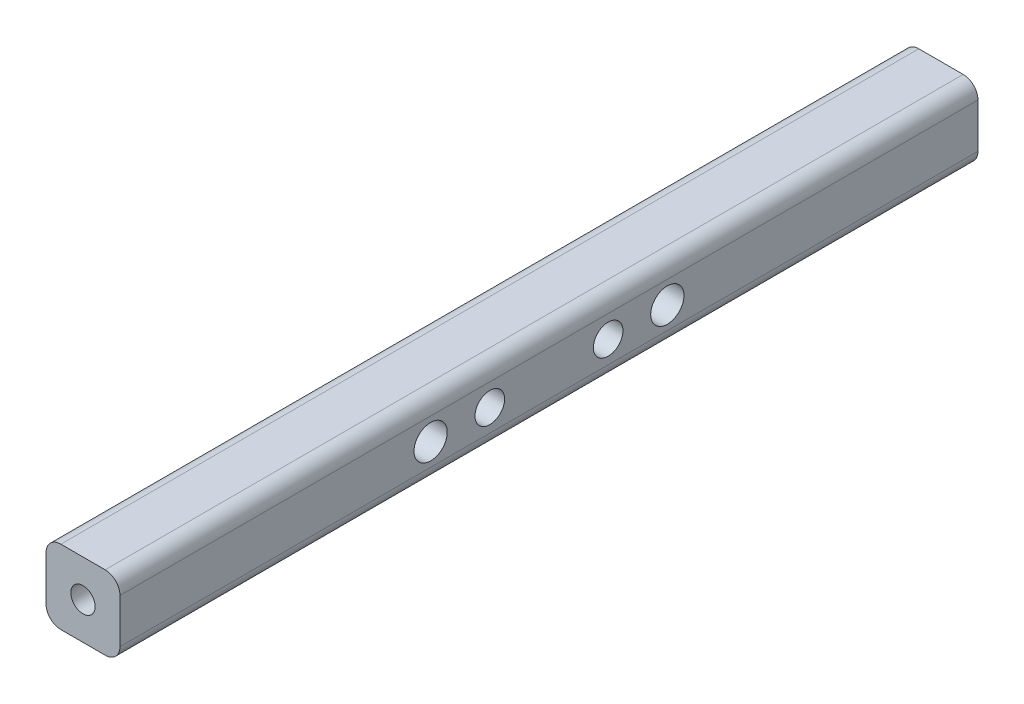
ISO-10303-21;
HEADER;
FILE_DESCRIPTION(('STEP AP214'),'2;1');
FILE_NAME('part.step','',(''),(''),'','','');
FILE_SCHEMA(('AUTOMOTIVE_DESIGN { 1 0 10303 214 1 1 1 1 }'));
ENDSEC;
DATA;
#1=APPLICATION_CONTEXT('core data for automotive mechanical design processes');
#2=APPLICATION_PROTOCOL_DEFINITION('international standard','automotive_design',2000,#1);
#3=PRODUCT_CONTEXT('',#1,'mechanical');
#4=PRODUCT('Part','Part','',(#3));
#5=PRODUCT_RELATED_PRODUCT_CATEGORY('part','',(#4));
#6=PRODUCT_DEFINITION_FORMATION('','',#4);
#7=PRODUCT_DEFINITION_CONTEXT('part definition',#1,'design');
#8=PRODUCT_DEFINITION('design','',#6,#7);
#9=PRODUCT_DEFINITION_SHAPE('','',#8);
#10=(LENGTH_UNIT() NAMED_UNIT(*) SI_UNIT(.MILLI.,.METRE.));
#11=(NAMED_UNIT(*) PLANE_ANGLE_UNIT() SI_UNIT($,.RADIAN.));
#12=(NAMED_UNIT(*) SI_UNIT($,.STERADIAN.) SOLID_ANGLE_UNIT());
#13=UNCERTAINTY_MEASURE_WITH_UNIT(LENGTH_MEASURE(1.E-05),#10,'distance_accuracy_value','');
#14=(GEOMETRIC_REPRESENTATION_CONTEXT(3) GLOBAL_UNCERTAINTY_ASSIGNED_CONTEXT((#13)) GLOBAL_UNIT_ASSIGNED_CONTEXT((#10,
#11,#12)) REPRESENTATION_CONTEXT('',''));
#15=CARTESIAN_POINT('',(0.,0.,0.));
#16=DIRECTION('',(0.,0.,1.));
#17=DIRECTION('',(1.,0.,0.));
#18=AXIS2_PLACEMENT_3D('',#15,#16,#17);
#19=CARTESIAN_POINT('',(-5.,5.,58.));
#20=DIRECTION('',(1.,0.,0.));
#21=DIRECTION('',(0.,1.,0.));
#22=AXIS2_PLACEMENT_3D('',#19,#20,#21);
#23=PLANE('',#22);
#24=DIRECTION('',(0.,0.,-1.));
#25=VECTOR('',#24,1.);
#26=CARTESIAN_POINT('',(-5.,3.,58.));
#27=LINE('',#26,#25);
#28=CARTESIAN_POINT('',(-5.,3.,13.3542486889354));
#29=VERTEX_POINT('',#28);
#30=CARTESIAN_POINT('',(-5.,3.,-13.3542486889354));
#31=VERTEX_POINT('',#30);
#32=EDGE_CURVE('E162',#29,#31,#27,.T.);
#33=ORIENTED_EDGE('',*,*,#32,.T.);
#34=CARTESIAN_POINT('',(-5.,0.,-16.));
#35=DIRECTION('',(-1.,0.,0.));
#36=DIRECTION('',(0.,0.,1.));
#37=AXIS2_PLACEMENT_3D('',#34,#35,#36);
#38=CIRCLE('',#37,4.);
#39=CARTESIAN_POINT('',(-5.,-3.,-13.3542486889354));
#40=VERTEX_POINT('',#39);
#41=EDGE_CURVE('E56',#40,#31,#38,.T.);
#42=ORIENTED_EDGE('',*,*,#41,.F.);
#43=DIRECTION('',(0.,0.,-1.));
#44=VECTOR('',#43,1.);
#45=CARTESIAN_POINT('',(-5.,-3.,58.));
#46=LINE('',#45,#44);
#47=CARTESIAN_POINT('',(-5.,-3.,13.3542486889354));
#48=VERTEX_POINT('',#47);
#49=EDGE_CURVE('E173',#40,#48,#46,.F.);
#50=ORIENTED_EDGE('',*,*,#49,.T.);
#51=CARTESIAN_POINT('',(-5.,0.,16.));
#52=DIRECTION('',(-1.,0.,0.));
#53=DIRECTION('',(0.,0.,1.));
#54=AXIS2_PLACEMENT_3D('',#51,#52,#53);
#55=CIRCLE('',#54,4.);
#56=EDGE_CURVE('E333',#29,#48,#55,.T.);
#57=ORIENTED_EDGE('',*,*,#56,.F.);
#58=EDGE_LOOP('',(#33,#42,#50,#57));
#59=FACE_BOUND('',#58,.T.);
#60=ADVANCED_FACE('F37',(#59),#23,.F.);
#61=CARTESIAN_POINT('',(-5.,3.,58.));
#62=VERTEX_POINT('',#61);
#63=CARTESIAN_POINT('',(-5.,3.,18.6457513110646));
#64=VERTEX_POINT('',#63);
#65=EDGE_CURVE('E165',#62,#64,#27,.T.);
#66=ORIENTED_EDGE('',*,*,#65,.T.);
#67=CARTESIAN_POINT('',(-5.,-3.,18.6457513110646));
#68=VERTEX_POINT('',#67);
#69=EDGE_CURVE('E64',#68,#64,#55,.T.);
#70=ORIENTED_EDGE('',*,*,#69,.F.);
#71=CARTESIAN_POINT('',(-5.,-3.,58.));
#72=VERTEX_POINT('',#71);
#73=EDGE_CURVE('E169',#68,#72,#46,.F.);
#74=ORIENTED_EDGE('',*,*,#73,.T.);
#75=DIRECTION('',(0.,-1.,0.));
#76=VECTOR('',#75,1.);
#77=CARTESIAN_POINT('',(-5.,5.,58.));
#78=LINE('',#77,#76);
#79=EDGE_CURVE('E346',#62,#72,#78,.T.);
#80=ORIENTED_EDGE('',*,*,#79,.F.);
#81=EDGE_LOOP('',(#66,#70,#74,#80));
#82=FACE_BOUND('',#81,.T.);
#83=ADVANCED_FACE('F257',(#82),#23,.F.);
#84=CARTESIAN_POINT('',(-5.,-3.,-58.));
#85=VERTEX_POINT('',#84);
#86=CARTESIAN_POINT('',(-5.,-3.,-18.6457513110646));
#87=VERTEX_POINT('',#86);
#88=EDGE_CURVE('E155',#85,#87,#46,.F.);
#89=ORIENTED_EDGE('',*,*,#88,.T.);
#90=CARTESIAN_POINT('',(-5.,3.,-18.6457513110646));
#91=VERTEX_POINT('',#90);
#92=EDGE_CURVE('E142',#91,#87,#38,.T.);
#93=ORIENTED_EDGE('',*,*,#92,.F.);
#94=CARTESIAN_POINT('',(-5.,3.,-58.));
#95=VERTEX_POINT('',#94);
#96=EDGE_CURVE('E152',#91,#95,#27,.T.);
#97=ORIENTED_EDGE('',*,*,#96,.T.);
#98=DIRECTION('',(0.,-1.,0.));
#99=VECTOR('',#98,1.);
#100=CARTESIAN_POINT('',(-5.,5.,-58.));
#101=LINE('',#100,#99);
#102=EDGE_CURVE('E361',#95,#85,#101,.T.);
#103=ORIENTED_EDGE('',*,*,#102,.T.);
#104=EDGE_LOOP('',(#89,#93,#97,#103));
#105=FACE_BOUND('',#104,.T.);
#106=ADVANCED_FACE('F150',(#105),#23,.F.);
#107=CARTESIAN_POINT('',(-5.,-5.,58.));
#108=DIRECTION('',(0.,1.,0.));
#109=DIRECTION('',(0.,0.,1.));
#110=AXIS2_PLACEMENT_3D('',#107,#108,#109);
#111=PLANE('',#110);
#112=DIRECTION('',(1.,0.,0.));
#113=VECTOR('',#112,1.);
#114=CARTESIAN_POINT('',(-5.,-5.,58.));
#115=LINE('',#114,#113);
#116=CARTESIAN_POINT('',(-3.,-5.,58.));
#117=VERTEX_POINT('',#116);
#118=CARTESIAN_POINT('',(3.,-5.,58.));
#119=VERTEX_POINT('',#118);
#120=EDGE_CURVE('E345',#117,#119,#115,.T.);
#121=ORIENTED_EDGE('',*,*,#120,.F.);
#122=DIRECTION('',(0.,0.,-1.));
#123=VECTOR('',#122,1.);
#124=CARTESIAN_POINT('',(-3.,-5.,58.));
#125=LINE('',#124,#123);
#126=CARTESIAN_POINT('',(-3.,-5.,-58.));
#127=VERTEX_POINT('',#126);
#128=EDGE_CURVE('E344',#117,#127,#125,.T.);
#129=ORIENTED_EDGE('',*,*,#128,.T.);
#130=DIRECTION('',(1.,0.,0.));
#131=VECTOR('',#130,1.);
#132=CARTESIAN_POINT('',(-5.,-5.,-58.));
#133=LINE('',#132,#131);
#134=CARTESIAN_POINT('',(3.,-5.,-58.));
#135=VERTEX_POINT('',#134);
#136=EDGE_CURVE('E363',#127,#135,#133,.T.);
#137=ORIENTED_EDGE('',*,*,#136,.T.);
#138=DIRECTION('',(0.,0.,-1.));
#139=VECTOR('',#138,1.);
#140=CARTESIAN_POINT('',(3.,-5.,58.));
#141=LINE('',#140,#139);
#142=EDGE_CURVE('E350',#135,#119,#141,.F.);
#143=ORIENTED_EDGE('',*,*,#142,.T.);
#144=EDGE_LOOP('',(#121,#129,#137,#143));
#145=FACE_BOUND('',#144,.T.);
#146=ADVANCED_FACE('F263',(#145),#111,.F.);
#147=CARTESIAN_POINT('',(5.,5.,58.));
#148=DIRECTION('',(-1.,0.,0.));
#149=DIRECTION('',(0.,-1.,0.));
#150=AXIS2_PLACEMENT_3D('',#147,#148,#149);
#151=PLANE('',#150);
#152=CARTESIAN_POINT('',(5.,0.,-16.));
#153=DIRECTION('',(-1.,0.,0.));
#154=DIRECTION('',(0.,0.,1.));
#155=AXIS2_PLACEMENT_3D('',#152,#153,#154);
#156=CIRCLE('',#155,2.25);
#157=CARTESIAN_POINT('',(5.,0.,-13.75));
#158=VERTEX_POINT('',#157);
#159=EDGE_CURVE('E241',#158,#158,#156,.T.);
#160=ORIENTED_EDGE('',*,*,#159,.T.);
#161=EDGE_LOOP('',(#160));
#162=FACE_BOUND('',#161,.T.);
#163=CARTESIAN_POINT('',(5.,0.,16.));
#164=DIRECTION('',(-1.,0.,0.));
#165=DIRECTION('',(0.,0.,1.));
#166=AXIS2_PLACEMENT_3D('',#163,#164,#165);
#167=CIRCLE('',#166,2.25);
#168=CARTESIAN_POINT('',(5.,0.,18.25));
#169=VERTEX_POINT('',#168);
#170=EDGE_CURVE('E223',#169,#169,#167,.T.);
#171=ORIENTED_EDGE('',*,*,#170,.T.);
#172=EDGE_LOOP('',(#171));
#173=FACE_BOUND('',#172,.T.);
#174=CARTESIAN_POINT('',(5.,0.,-8.));
#175=DIRECTION('',(1.,0.,0.));
#176=DIRECTION('',(0.,0.,-1.));
#177=AXIS2_PLACEMENT_3D('',#174,#175,#176);
#178=CIRCLE('',#177,1.99999999999999);
#179=CARTESIAN_POINT('',(5.,0.,-9.99999999999999));
#180=VERTEX_POINT('',#179);
#181=EDGE_CURVE('E222',#180,#180,#178,.T.);
#182=ORIENTED_EDGE('',*,*,#181,.F.);
#183=EDGE_LOOP('',(#182));
#184=FACE_BOUND('',#183,.T.);
#185=CARTESIAN_POINT('',(5.,0.,8.));
#186=DIRECTION('',(1.,0.,0.));
#187=DIRECTION('',(0.,0.,-1.));
#188=AXIS2_PLACEMENT_3D('',#185,#186,#187);
#189=CIRCLE('',#188,1.99999999999999);
#190=CARTESIAN_POINT('',(5.,0.,6.00000000000001));
#191=VERTEX_POINT('',#190);
#192=EDGE_CURVE('E404',#191,#191,#189,.T.);
#193=ORIENTED_EDGE('',*,*,#192,.F.);
#194=EDGE_LOOP('',(#193));
#195=FACE_BOUND('',#194,.T.);
#196=DIRECTION('',(0.,1.,0.));
#197=VECTOR('',#196,1.);
#198=CARTESIAN_POINT('',(5.,5.,-58.));
#199=LINE('',#198,#197);
#200=CARTESIAN_POINT('',(5.,-3.,-58.));
#201=VERTEX_POINT('',#200);
#202=CARTESIAN_POINT('',(5.,3.,-58.));
#203=VERTEX_POINT('',#202);
#204=EDGE_CURVE('E366',#201,#203,#199,.T.);
#205=ORIENTED_EDGE('',*,*,#204,.T.);
#206=DIRECTION('',(0.,0.,-1.));
#207=VECTOR('',#206,1.);
#208=CARTESIAN_POINT('',(5.,3.,58.));
#209=LINE('',#208,#207);
#210=CARTESIAN_POINT('',(5.,3.,58.));
#211=VERTEX_POINT('',#210);
#212=EDGE_CURVE('E198',#203,#211,#209,.F.);
#213=ORIENTED_EDGE('',*,*,#212,.T.);
#214=DIRECTION('',(0.,1.,0.));
#215=VECTOR('',#214,1.);
#216=CARTESIAN_POINT('',(5.,5.,58.));
#217=LINE('',#216,#215);
#218=CARTESIAN_POINT('',(5.,-3.,58.));
#219=VERTEX_POINT('',#218);
#220=EDGE_CURVE('E351',#219,#211,#217,.T.);
#221=ORIENTED_EDGE('',*,*,#220,.F.);
#222=DIRECTION('',(0.,0.,-1.));
#223=VECTOR('',#222,1.);
#224=CARTESIAN_POINT('',(5.,-3.,58.));
#225=LINE('',#224,#223);
#226=EDGE_CURVE('E195',#219,#201,#225,.T.);
#227=ORIENTED_EDGE('',*,*,#226,.T.);
#228=EDGE_LOOP('',(#205,#213,#221,#227));
#229=FACE_BOUND('',#228,.T.);
#230=ADVANCED_FACE('F267',(#162,#173,#184,#195,#229),#151,.F.);
#231=CARTESIAN_POINT('',(-5.,5.,58.));
#232=DIRECTION('',(0.,-1.,0.));
#233=DIRECTION('',(0.,0.,-1.));
#234=AXIS2_PLACEMENT_3D('',#231,#232,#233);
#235=PLANE('',#234);
#236=DIRECTION('',(-1.,0.,0.));
#237=VECTOR('',#236,1.);
#238=CARTESIAN_POINT('',(-5.,5.,-58.));
#239=LINE('',#238,#237);
#240=CARTESIAN_POINT('',(3.,5.,-58.));
#241=VERTEX_POINT('',#240);
#242=CARTESIAN_POINT('',(-3.,5.,-58.));
#243=VERTEX_POINT('',#242);
#244=EDGE_CURVE('E355',#241,#243,#239,.T.);
#245=ORIENTED_EDGE('',*,*,#244,.T.);
#246=DIRECTION('',(0.,0.,-1.));
#247=VECTOR('',#246,1.);
#248=CARTESIAN_POINT('',(-3.,5.,58.));
#249=LINE('',#248,#247);
#250=CARTESIAN_POINT('',(-3.,5.,58.));
#251=VERTEX_POINT('',#250);
#252=EDGE_CURVE('E193',#243,#251,#249,.F.);
#253=ORIENTED_EDGE('',*,*,#252,.T.);
#254=DIRECTION('',(-1.,0.,0.));
#255=VECTOR('',#254,1.);
#256=CARTESIAN_POINT('',(-5.,5.,58.));
#257=LINE('',#256,#255);
#258=CARTESIAN_POINT('',(3.,5.,58.));
#259=VERTEX_POINT('',#258);
#260=EDGE_CURVE('E353',#259,#251,#257,.T.);
#261=ORIENTED_EDGE('',*,*,#260,.F.);
#262=DIRECTION('',(0.,0.,-1.));
#263=VECTOR('',#262,1.);
#264=CARTESIAN_POINT('',(3.,5.,58.));
#265=LINE('',#264,#263);
#266=EDGE_CURVE('E190',#259,#241,#265,.T.);
#267=ORIENTED_EDGE('',*,*,#266,.T.);
#268=EDGE_LOOP('',(#245,#253,#261,#267));
#269=FACE_BOUND('',#268,.T.);
#270=ADVANCED_FACE('F272',(#269),#235,.F.);
#271=CARTESIAN_POINT('',(0.,0.,58.));
#272=DIRECTION('',(0.,0.,1.));
#273=DIRECTION('',(1.,0.,0.));
#274=AXIS2_PLACEMENT_3D('',#271,#272,#273);
#275=PLANE('',#274);
#276=CARTESIAN_POINT('',(0.,0.,58.));
#277=DIRECTION('',(0.,0.,1.));
#278=DIRECTION('',(1.,0.,0.));
#279=AXIS2_PLACEMENT_3D('',#276,#277,#278);
#280=CIRCLE('',#279,1.65);
#281=CARTESIAN_POINT('',(1.65,0.,58.));
#282=VERTEX_POINT('',#281);
#283=EDGE_CURVE('E419',#282,#282,#280,.T.);
#284=ORIENTED_EDGE('',*,*,#283,.F.);
#285=EDGE_LOOP('',(#284));
#286=FACE_BOUND('',#285,.T.);
#287=ORIENTED_EDGE('',*,*,#79,.T.);
#288=CARTESIAN_POINT('',(-3.,-3.,58.));
#289=DIRECTION('',(0.,0.,1.));
#290=DIRECTION('',(1.,0.,0.));
#291=AXIS2_PLACEMENT_3D('',#288,#289,#290);
#292=CIRCLE('',#291,2.);
#293=EDGE_CURVE('E188',#72,#117,#292,.T.);
#294=ORIENTED_EDGE('',*,*,#293,.T.);
#295=ORIENTED_EDGE('',*,*,#120,.T.);
#296=CARTESIAN_POINT('',(3.,-3.,58.));
#297=DIRECTION('',(0.,0.,1.));
#298=DIRECTION('',(1.,0.,0.));
#299=AXIS2_PLACEMENT_3D('',#296,#297,#298);
#300=CIRCLE('',#299,2.);
#301=EDGE_CURVE('E177',#119,#219,#300,.T.);
#302=ORIENTED_EDGE('',*,*,#301,.T.);
#303=ORIENTED_EDGE('',*,*,#220,.T.);
#304=CARTESIAN_POINT('',(3.,3.,58.));
#305=DIRECTION('',(0.,0.,1.));
#306=DIRECTION('',(1.,0.,0.));
#307=AXIS2_PLACEMENT_3D('',#304,#305,#306);
#308=CIRCLE('',#307,2.);
#309=EDGE_CURVE('E178',#211,#259,#308,.T.);
#310=ORIENTED_EDGE('',*,*,#309,.T.);
#311=ORIENTED_EDGE('',*,*,#260,.T.);
#312=CARTESIAN_POINT('',(-3.,3.,58.));
#313=DIRECTION('',(0.,0.,1.));
#314=DIRECTION('',(1.,0.,0.));
#315=AXIS2_PLACEMENT_3D('',#312,#313,#314);
#316=CIRCLE('',#315,2.);
#317=EDGE_CURVE('E184',#251,#62,#316,.T.);
#318=ORIENTED_EDGE('',*,*,#317,.T.);
#319=EDGE_LOOP('',(#287,#294,#295,#302,#303,#310,#311,#318));
#320=FACE_BOUND('',#319,.T.);
#321=ADVANCED_FACE('F279',(#286,#320),#275,.T.);
#322=CARTESIAN_POINT('',(0.,0.,-58.));
#323=DIRECTION('',(0.,0.,1.));
#324=DIRECTION('',(1.,0.,0.));
#325=AXIS2_PLACEMENT_3D('',#322,#323,#324);
#326=PLANE('',#325);
#327=CARTESIAN_POINT('',(0.,0.,-58.));
#328=DIRECTION('',(0.,0.,-1.));
#329=DIRECTION('',(-1.,0.,0.));
#330=AXIS2_PLACEMENT_3D('',#327,#328,#329);
#331=CIRCLE('',#330,1.64999999999999);
#332=CARTESIAN_POINT('',(-1.64999999999999,0.,-58.));
#333=VERTEX_POINT('',#332);
#334=EDGE_CURVE('E410',#333,#333,#331,.T.);
#335=ORIENTED_EDGE('',*,*,#334,.F.);
#336=EDGE_LOOP('',(#335));
#337=FACE_BOUND('',#336,.T.);
#338=ORIENTED_EDGE('',*,*,#136,.F.);
#339=CARTESIAN_POINT('',(-3.,-3.,-58.));
#340=DIRECTION('',(0.,0.,1.));
#341=DIRECTION('',(1.,0.,0.));
#342=AXIS2_PLACEMENT_3D('',#339,#340,#341);
#343=CIRCLE('',#342,2.);
#344=EDGE_CURVE('E163',#127,#85,#343,.F.);
#345=ORIENTED_EDGE('',*,*,#344,.T.);
#346=ORIENTED_EDGE('',*,*,#102,.F.);
#347=CARTESIAN_POINT('',(-3.,3.,-58.));
#348=DIRECTION('',(0.,0.,1.));
#349=DIRECTION('',(1.,0.,0.));
#350=AXIS2_PLACEMENT_3D('',#347,#348,#349);
#351=CIRCLE('',#350,2.);
#352=EDGE_CURVE('E160',#95,#243,#351,.F.);
#353=ORIENTED_EDGE('',*,*,#352,.T.);
#354=ORIENTED_EDGE('',*,*,#244,.F.);
#355=CARTESIAN_POINT('',(3.,3.,-58.));
#356=DIRECTION('',(0.,0.,1.));
#357=DIRECTION('',(1.,0.,0.));
#358=AXIS2_PLACEMENT_3D('',#355,#356,#357);
#359=CIRCLE('',#358,2.);
#360=EDGE_CURVE('E375',#241,#203,#359,.F.);
#361=ORIENTED_EDGE('',*,*,#360,.T.);
#362=ORIENTED_EDGE('',*,*,#204,.F.);
#363=CARTESIAN_POINT('',(3.,-3.,-58.));
#364=DIRECTION('',(0.,0.,1.));
#365=DIRECTION('',(1.,0.,0.));
#366=AXIS2_PLACEMENT_3D('',#363,#364,#365);
#367=CIRCLE('',#366,2.);
#368=EDGE_CURVE('E373',#201,#135,#367,.F.);
#369=ORIENTED_EDGE('',*,*,#368,.T.);
#370=EDGE_LOOP('',(#338,#345,#346,#353,#354,#361,#362,#369));
#371=FACE_BOUND('',#370,.T.);
#372=ADVANCED_FACE('F230',(#337,#371),#326,.F.);
#373=CARTESIAN_POINT('',(-3.,-3.,58.));
#374=DIRECTION('',(0.,0.,-1.));
#375=DIRECTION('',(-1.,0.,0.));
#376=AXIS2_PLACEMENT_3D('',#373,#374,#375);
#377=CYLINDRICAL_SURFACE('',#376,2.);
#378=CARTESIAN_POINT('',(-5.,-3.,-18.6457513110646));
#379=CARTESIAN_POINT('',(-4.99999053834747,-3.05603665063193,-18.5822208671282));
#380=CARTESIAN_POINT('',(-4.99764665293922,-3.11000255184419,-18.5169519789411));
#381=CARTESIAN_POINT('',(-4.98924761810448,-3.21353115456925,-18.3833461244196));
#382=CARTESIAN_POINT('',(-4.9831966166614,-3.26309870663608,-18.3150126661979));
#383=CARTESIAN_POINT('',(-4.96092723278398,-3.40486224555668,-18.1060012471417));
#384=CARTESIAN_POINT('',(-4.94058716366979,-3.4902751002625,-17.9611347728313));
#385=CARTESIAN_POINT('',(-4.89189149146419,-3.65528238966943,-17.6363451758536));
#386=CARTESIAN_POINT('',(-4.86275699924706,-3.73127837830353,-17.4547082089186));
#387=CARTESIAN_POINT('',(-4.82232526098066,-3.82478744856143,-17.1750245909797));
#388=CARTESIAN_POINT('',(-4.80938613725141,-3.85255363685774,-17.0805323074465));
#389=CARTESIAN_POINT('',(-4.78571389247698,-3.90108708350636,-16.889507180519));
#390=CARTESIAN_POINT('',(-4.77497997610187,-3.9218568669164,-16.7929750867044));
#391=CARTESIAN_POINT('',(-4.75542048508017,-3.95864344572463,-16.5846700771713));
#392=CARTESIAN_POINT('',(-4.74707397425222,-3.97358448499036,-16.4726591074761));
#393=CARTESIAN_POINT('',(-4.73557814171573,-3.99393533426448,-16.2474991596869));
#394=CARTESIAN_POINT('',(-4.73242883837603,-3.99934511058588,-16.1343501775722));
#395=CARTESIAN_POINT('',(-4.73173749209427,-4.00054279497153,-15.9079995438637));
#396=CARTESIAN_POINT('',(-4.73419463817906,-3.99633209463803,-15.7947979022554));
#397=CARTESIAN_POINT('',(-4.74439398565472,-3.97836311885006,-15.5694063350102));
#398=CARTESIAN_POINT('',(-4.75213613508299,-3.9646049372672,-15.4572163994372));
#399=CARTESIAN_POINT('',(-4.77070685902393,-3.93001518151672,-15.248501589608));
#400=CARTESIAN_POINT('',(-4.78103731769295,-3.91026462031027,-15.1517504800929));
#401=CARTESIAN_POINT('',(-4.80405120829244,-3.86375349137156,-14.9602234579663));
#402=CARTESIAN_POINT('',(-4.81673568328157,-3.83698981397111,-14.8654484417452));
#403=CARTESIAN_POINT('',(-4.8566719361795,-3.74641836930911,-14.584742964655));
#404=CARTESIAN_POINT('',(-4.88582689334104,-3.67229915997185,-14.402246616612));
#405=CARTESIAN_POINT('',(-4.92433294412668,-3.54641812588015,-14.1478236597811));
#406=CARTESIAN_POINT('',(-4.93568445068804,-3.50512750395293,-14.0708195421887));
#407=CARTESIAN_POINT('',(-4.95646280822992,-3.41747192949476,-13.9194900594673));
#408=CARTESIAN_POINT('',(-4.96589038808206,-3.37110890888451,-13.8451636887056));
#409=CARTESIAN_POINT('',(-4.98184547921322,-3.27339208180091,-13.6994343561417));
#410=CARTESIAN_POINT('',(-4.98837052917087,-3.22203408442566,-13.628033921907));
#411=CARTESIAN_POINT('',(-4.99744439861107,-3.11453588134918,-13.4885368400754));
#412=CARTESIAN_POINT('',(-4.99998844483158,-3.05839001983606,-13.4204442532139));
#413=CARTESIAN_POINT('',(-5.,-3.,-13.3542486889354));
#414=B_SPLINE_CURVE_WITH_KNOTS('',3,(#378,#379,#380,#381,#382,#383,#384,#385,#386,#387,#388,
#389,#390,#391,#392,#393,#394,#395,#396,#397,#398,#399,#400,#401,#402,#403,#404,#405,#406,#407,
#408,#409,#410,#411,#412,#413),.UNSPECIFIED.,.F.,.F.,(4,2,2,2,2,2,2,2,2,2,2,2,2,2,2,2,2,4),(0.,
0.253960019944098,0.507636395446799,1.01428717573525,1.60909635209939,1.90686362447003,
2.20452331485238,2.5439468435731,2.88337157193878,3.22274720561546,3.56211950257046,
3.85965693848272,4.15732652862498,4.75210362493645,5.0162936798517,5.28038346090031,
5.54469676296449,5.80932673707194),.UNSPECIFIED.);
#415=EDGE_CURVE('E235',#87,#40,#414,.T.);
#416=ORIENTED_EDGE('',*,*,#415,.F.);
#417=ORIENTED_EDGE('',*,*,#88,.F.);
#418=ORIENTED_EDGE('',*,*,#344,.F.);
#419=ORIENTED_EDGE('',*,*,#128,.F.);
#420=ORIENTED_EDGE('',*,*,#293,.F.);
#421=ORIENTED_EDGE('',*,*,#73,.F.);
#422=CARTESIAN_POINT('',(-5.,-3.,13.3542486889354));
#423=CARTESIAN_POINT('',(-4.99999053834747,-3.05603665063193,13.4177791328718));
#424=CARTESIAN_POINT('',(-4.99764665293922,-3.1100025518442,13.4830480210589));
#425=CARTESIAN_POINT('',(-4.98924761810448,-3.21353115456926,13.6166538755804));
#426=CARTESIAN_POINT('',(-4.9831966166614,-3.26309870663609,13.6849873338021));
#427=CARTESIAN_POINT('',(-4.96092723278398,-3.40486224555668,13.8939987528583));
#428=CARTESIAN_POINT('',(-4.94058716366979,-3.4902751002625,14.0388652271687));
#429=CARTESIAN_POINT('',(-4.89189149146419,-3.65528238966943,14.3636548241464));
#430=CARTESIAN_POINT('',(-4.86275699924705,-3.73127837830353,14.5452917910814));
#431=CARTESIAN_POINT('',(-4.82232526098066,-3.82478744856143,14.8249754090203));
#432=CARTESIAN_POINT('',(-4.8093861372514,-3.85255363685775,14.9194676925535));
#433=CARTESIAN_POINT('',(-4.78571389247698,-3.90108708350636,15.110492819481));
#434=CARTESIAN_POINT('',(-4.77497997610187,-3.9218568669164,15.2070249132956));
#435=CARTESIAN_POINT('',(-4.75542048508017,-3.95864344572463,15.4153299228287));
#436=CARTESIAN_POINT('',(-4.74707397425222,-3.97358448499037,15.5273408925239));
#437=CARTESIAN_POINT('',(-4.73557814171573,-3.99393533426449,15.7525008403131));
#438=CARTESIAN_POINT('',(-4.73242883837603,-3.99934511058588,15.8656498224278));
#439=CARTESIAN_POINT('',(-4.73173749209427,-4.00054279497153,16.0920004561363));
#440=CARTESIAN_POINT('',(-4.73419463817906,-3.99633209463803,16.2052020977446));
#441=CARTESIAN_POINT('',(-4.74439398565472,-3.97836311885006,16.4305936649898));
#442=CARTESIAN_POINT('',(-4.75213613508299,-3.9646049372672,16.5427836005628));
#443=CARTESIAN_POINT('',(-4.77070685902393,-3.93001518151672,16.751498410392));
#444=CARTESIAN_POINT('',(-4.78103731769295,-3.91026462031027,16.8482495199071));
#445=CARTESIAN_POINT('',(-4.80405120829244,-3.86375349137156,17.0397765420337));
#446=CARTESIAN_POINT('',(-4.81673568328157,-3.83698981397111,17.1345515582549));
#447=CARTESIAN_POINT('',(-4.8566719361795,-3.74641836930911,17.415257035345));
#448=CARTESIAN_POINT('',(-4.88582689334104,-3.67229915997185,17.597753383388));
#449=CARTESIAN_POINT('',(-4.92433294412668,-3.54641812588015,17.8521763402189));
#450=CARTESIAN_POINT('',(-4.93568445068804,-3.50512750395293,17.9291804578113));
#451=CARTESIAN_POINT('',(-4.95646280822992,-3.41747192949476,18.0805099405327));
#452=CARTESIAN_POINT('',(-4.96589038808206,-3.37110890888451,18.1548363112944));
#453=CARTESIAN_POINT('',(-4.98184547921322,-3.27339208180091,18.3005656438583));
#454=CARTESIAN_POINT('',(-4.98837052917087,-3.22203408442566,18.371966078093));
#455=CARTESIAN_POINT('',(-4.99744439861107,-3.11453588134918,18.5114631599246));
#456=CARTESIAN_POINT('',(-4.99998844483158,-3.05839001983605,18.5795557467861));
#457=CARTESIAN_POINT('',(-5.,-3.,18.6457513110646));
#458=B_SPLINE_CURVE_WITH_KNOTS('',3,(#422,#423,#424,#425,#426,#427,#428,#429,#430,#431,#432,
#433,#434,#435,#436,#437,#438,#439,#440,#441,#442,#443,#444,#445,#446,#447,#448,#449,#450,#451,
#452,#453,#454,#455,#456,#457),.UNSPECIFIED.,.F.,.F.,(4,2,2,2,2,2,2,2,2,2,2,2,2,2,2,2,2,4),(0.,
0.253960019944099,0.507636395446802,1.01428717573525,1.60909635209939,1.90686362447003,
2.20452331485238,2.54394684357309,2.88337157193878,3.22274720561545,3.56211950257045,
3.85965693848271,4.15732652862498,4.75210362493645,5.01629367985169,5.28038346090031,
5.54469676296449,5.80932673707194),.UNSPECIFIED.);
#459=EDGE_CURVE('E216',#48,#68,#458,.T.);
#460=ORIENTED_EDGE('',*,*,#459,.F.);
#461=ORIENTED_EDGE('',*,*,#49,.F.);
#462=EDGE_LOOP('',(#416,#417,#418,#419,#420,#421,#460,#461));
#463=FACE_BOUND('',#462,.T.);
#464=ADVANCED_FACE('F226',(#463),#377,.T.);
#465=CARTESIAN_POINT('',(-3.,3.,58.));
#466=DIRECTION('',(0.,0.,-1.));
#467=DIRECTION('',(-1.,0.,0.));
#468=AXIS2_PLACEMENT_3D('',#465,#466,#467);
#469=CYLINDRICAL_SURFACE('',#468,2.);
#470=CARTESIAN_POINT('',(-5.,3.,-13.3542486889354));
#471=CARTESIAN_POINT('',(-4.99999053834747,3.05603665063193,-13.4177791328718));
#472=CARTESIAN_POINT('',(-4.99764665293922,3.1100025518442,-13.4830480210589));
#473=CARTESIAN_POINT('',(-4.98924761810448,3.21353115456926,-13.6166538755804));
#474=CARTESIAN_POINT('',(-4.9831966166614,3.26309870663609,-13.6849873338021));
#475=CARTESIAN_POINT('',(-4.96092723278398,3.40486224555668,-13.8939987528583));
#476=CARTESIAN_POINT('',(-4.94058716366979,3.4902751002625,-14.0388652271687));
#477=CARTESIAN_POINT('',(-4.89189149146419,3.65528238966943,-14.3636548241464));
#478=CARTESIAN_POINT('',(-4.86275699924705,3.73127837830353,-14.5452917910814));
#479=CARTESIAN_POINT('',(-4.82232526098066,3.82478744856143,-14.8249754090203));
#480=CARTESIAN_POINT('',(-4.8093861372514,3.85255363685775,-14.9194676925535));
#481=CARTESIAN_POINT('',(-4.78571389247698,3.90108708350636,-15.110492819481));
#482=CARTESIAN_POINT('',(-4.77497997610187,3.9218568669164,-15.2070249132956));
#483=CARTESIAN_POINT('',(-4.75542048508017,3.95864344572463,-15.4153299228287));
#484=CARTESIAN_POINT('',(-4.74707397425222,3.97358448499036,-15.5273408925239));
#485=CARTESIAN_POINT('',(-4.73557814171573,3.99393533426448,-15.7525008403131));
#486=CARTESIAN_POINT('',(-4.73242883837603,3.99934511058588,-15.8656498224278));
#487=CARTESIAN_POINT('',(-4.73173749209427,4.00054279497153,-16.0920004561363));
#488=CARTESIAN_POINT('',(-4.73419463817906,3.99633209463803,-16.2052020977446));
#489=CARTESIAN_POINT('',(-4.74439398565472,3.97836311885005,-16.4305936649898));
#490=CARTESIAN_POINT('',(-4.75213613508299,3.96460493726719,-16.5427836005628));
#491=CARTESIAN_POINT('',(-4.77070685902393,3.93001518151672,-16.751498410392));
#492=CARTESIAN_POINT('',(-4.78103731769295,3.91026462031027,-16.8482495199071));
#493=CARTESIAN_POINT('',(-4.80405120829244,3.86375349137156,-17.0397765420338));
#494=CARTESIAN_POINT('',(-4.81673568328157,3.8369898139711,-17.1345515582549));
#495=CARTESIAN_POINT('',(-4.8566719361795,3.74641836930911,-17.415257035345));
#496=CARTESIAN_POINT('',(-4.88582689334104,3.67229915997185,-17.597753383388));
#497=CARTESIAN_POINT('',(-4.92433294412668,3.54641812588015,-17.8521763402189));
#498=CARTESIAN_POINT('',(-4.93568445068804,3.50512750395293,-17.9291804578113));
#499=CARTESIAN_POINT('',(-4.95646280822992,3.41747192949475,-18.0805099405327));
#500=CARTESIAN_POINT('',(-4.96589038808206,3.3711089088845,-18.1548363112944));
#501=CARTESIAN_POINT('',(-4.98184547921322,3.2733920818009,-18.3005656438583));
#502=CARTESIAN_POINT('',(-4.98837052917087,3.22203408442565,-18.371966078093));
#503=CARTESIAN_POINT('',(-4.99744439861107,3.11453588134917,-18.5114631599246));
#504=CARTESIAN_POINT('',(-4.99998844483158,3.05839001983605,-18.5795557467861));
#505=CARTESIAN_POINT('',(-5.,3.,-18.6457513110646));
#506=B_SPLINE_CURVE_WITH_KNOTS('',3,(#470,#471,#472,#473,#474,#475,#476,#477,#478,#479,#480,
#481,#482,#483,#484,#485,#486,#487,#488,#489,#490,#491,#492,#493,#494,#495,#496,#497,#498,#499,
#500,#501,#502,#503,#504,#505),.UNSPECIFIED.,.F.,.F.,(4,2,2,2,2,2,2,2,2,2,2,2,2,2,2,2,2,4),(0.,
0.2539600199441,0.507636395446801,1.01428717573525,1.60909635209939,1.90686362447003,
2.20452331485238,2.54394684357309,2.88337157193878,3.22274720561545,3.56211950257045,
3.85965693848271,4.15732652862498,4.75210362493645,5.01629367985169,5.28038346090031,
5.54469676296449,5.80932673707194),.UNSPECIFIED.);
#507=EDGE_CURVE('E11',#31,#91,#506,.T.);
#508=ORIENTED_EDGE('',*,*,#507,.F.);
#509=ORIENTED_EDGE('',*,*,#32,.F.);
#510=CARTESIAN_POINT('',(-5.,3.,18.6457513110646));
#511=CARTESIAN_POINT('',(-4.99999053834747,3.05603665063193,18.5822208671282));
#512=CARTESIAN_POINT('',(-4.99764665293922,3.1100025518442,18.5169519789411));
#513=CARTESIAN_POINT('',(-4.98924761810448,3.21353115456926,18.3833461244196));
#514=CARTESIAN_POINT('',(-4.9831966166614,3.26309870663608,18.3150126661979));
#515=CARTESIAN_POINT('',(-4.96092723278398,3.40486224555668,18.1060012471417));
#516=CARTESIAN_POINT('',(-4.94058716366979,3.4902751002625,17.9611347728313));
#517=CARTESIAN_POINT('',(-4.89189149146419,3.65528238966943,17.6363451758536));
#518=CARTESIAN_POINT('',(-4.86275699924705,3.73127837830353,17.4547082089186));
#519=CARTESIAN_POINT('',(-4.82232526098066,3.82478744856143,17.1750245909797));
#520=CARTESIAN_POINT('',(-4.8093861372514,3.85255363685775,17.0805323074465));
#521=CARTESIAN_POINT('',(-4.78571389247698,3.90108708350636,16.889507180519));
#522=CARTESIAN_POINT('',(-4.77497997610187,3.9218568669164,16.7929750867044));
#523=CARTESIAN_POINT('',(-4.75542048508017,3.95864344572463,16.5846700771713));
#524=CARTESIAN_POINT('',(-4.74707397425222,3.97358448499036,16.4726591074761));
#525=CARTESIAN_POINT('',(-4.73557814171573,3.99393533426448,16.2474991596869));
#526=CARTESIAN_POINT('',(-4.73242883837603,3.99934511058588,16.1343501775722));
#527=CARTESIAN_POINT('',(-4.73173749209427,4.00054279497153,15.9079995438637));
#528=CARTESIAN_POINT('',(-4.73419463817906,3.99633209463803,15.7947979022554));
#529=CARTESIAN_POINT('',(-4.74439398565472,3.97836311885005,15.5694063350102));
#530=CARTESIAN_POINT('',(-4.75213613508299,3.96460493726719,15.4572163994372));
#531=CARTESIAN_POINT('',(-4.77070685902393,3.93001518151672,15.248501589608));
#532=CARTESIAN_POINT('',(-4.78103731769295,3.91026462031027,15.1517504800929));
#533=CARTESIAN_POINT('',(-4.80405120829244,3.86375349137156,14.9602234579663));
#534=CARTESIAN_POINT('',(-4.81673568328157,3.8369898139711,14.8654484417451));
#535=CARTESIAN_POINT('',(-4.8566719361795,3.74641836930911,14.584742964655));
#536=CARTESIAN_POINT('',(-4.88582689334104,3.67229915997185,14.402246616612));
#537=CARTESIAN_POINT('',(-4.92433294412668,3.54641812588015,14.1478236597811));
#538=CARTESIAN_POINT('',(-4.93568445068804,3.50512750395293,14.0708195421887));
#539=CARTESIAN_POINT('',(-4.95646280822992,3.41747192949476,13.9194900594673));
#540=CARTESIAN_POINT('',(-4.96589038808206,3.3711089088845,13.8451636887056));
#541=CARTESIAN_POINT('',(-4.98184547921322,3.27339208180091,13.6994343561417));
#542=CARTESIAN_POINT('',(-4.98837052917087,3.22203408442566,13.628033921907));
#543=CARTESIAN_POINT('',(-4.99744439861107,3.11453588134918,13.4885368400754));
#544=CARTESIAN_POINT('',(-4.99998844483158,3.05839001983605,13.4204442532139));
#545=CARTESIAN_POINT('',(-5.,3.,13.3542486889354));
#546=B_SPLINE_CURVE_WITH_KNOTS('',3,(#510,#511,#512,#513,#514,#515,#516,#517,#518,#519,#520,
#521,#522,#523,#524,#525,#526,#527,#528,#529,#530,#531,#532,#533,#534,#535,#536,#537,#538,#539,
#540,#541,#542,#543,#544,#545),.UNSPECIFIED.,.F.,.F.,(4,2,2,2,2,2,2,2,2,2,2,2,2,2,2,2,2,4),(0.,
0.253960019944102,0.507636395446801,1.01428717573525,1.60909635209939,1.90686362447004,
2.20452331485238,2.54394684357309,2.88337157193878,3.22274720561545,3.56211950257046,
3.85965693848271,4.15732652862498,4.75210362493645,5.0162936798517,5.28038346090031,
5.54469676296449,5.80932673707194),.UNSPECIFIED.);
#547=EDGE_CURVE('E50',#64,#29,#546,.T.);
#548=ORIENTED_EDGE('',*,*,#547,.F.);
#549=ORIENTED_EDGE('',*,*,#65,.F.);
#550=ORIENTED_EDGE('',*,*,#317,.F.);
#551=ORIENTED_EDGE('',*,*,#252,.F.);
#552=ORIENTED_EDGE('',*,*,#352,.F.);
#553=ORIENTED_EDGE('',*,*,#96,.F.);
#554=EDGE_LOOP('',(#508,#509,#548,#549,#550,#551,#552,#553));
#555=FACE_BOUND('',#554,.T.);
#556=ADVANCED_FACE('F158',(#555),#469,.T.);
#557=CARTESIAN_POINT('',(3.,3.,58.));
#558=DIRECTION('',(0.,0.,-1.));
#559=DIRECTION('',(-1.,0.,0.));
#560=AXIS2_PLACEMENT_3D('',#557,#558,#559);
#561=CYLINDRICAL_SURFACE('',#560,2.);
#562=ORIENTED_EDGE('',*,*,#309,.F.);
#563=ORIENTED_EDGE('',*,*,#212,.F.);
#564=ORIENTED_EDGE('',*,*,#360,.F.);
#565=ORIENTED_EDGE('',*,*,#266,.F.);
#566=EDGE_LOOP('',(#562,#563,#564,#565));
#567=FACE_BOUND('',#566,.T.);
#568=ADVANCED_FACE('F384',(#567),#561,.T.);
#569=CARTESIAN_POINT('',(3.,-3.,58.));
#570=DIRECTION('',(0.,0.,-1.));
#571=DIRECTION('',(-1.,0.,0.));
#572=AXIS2_PLACEMENT_3D('',#569,#570,#571);
#573=CYLINDRICAL_SURFACE('',#572,2.);
#574=ORIENTED_EDGE('',*,*,#301,.F.);
#575=ORIENTED_EDGE('',*,*,#142,.F.);
#576=ORIENTED_EDGE('',*,*,#368,.F.);
#577=ORIENTED_EDGE('',*,*,#226,.F.);
#578=EDGE_LOOP('',(#574,#575,#576,#577));
#579=FACE_BOUND('',#578,.T.);
#580=ADVANCED_FACE('F39',(#579),#573,.T.);
#581=CARTESIAN_POINT('',(0.,0.,46.5));
#582=DIRECTION('',(0.,0.,1.));
#583=DIRECTION('',(1.,0.,0.));
#584=AXIS2_PLACEMENT_3D('',#581,#582,#583);
#585=CONICAL_SURFACE('',#584,1.65,1.02974425867665);
#586=CARTESIAN_POINT('',(0.,0.,45.5085799786045));
#587=VERTEX_POINT('',#586);
#588=VERTEX_LOOP('',#587);
#589=FACE_BOUND('',#588,.T.);
#590=CARTESIAN_POINT('',(0.,0.,46.5));
#591=DIRECTION('',(0.,0.,1.));
#592=DIRECTION('',(1.,0.,0.));
#593=AXIS2_PLACEMENT_3D('',#590,#591,#592);
#594=CIRCLE('',#593,1.65);
#595=CARTESIAN_POINT('',(1.65,0.,46.5));
#596=VERTEX_POINT('',#595);
#597=EDGE_CURVE('E364',#596,#596,#594,.T.);
#598=ORIENTED_EDGE('',*,*,#597,.T.);
#599=EDGE_LOOP('',(#598));
#600=FACE_BOUND('',#599,.T.);
#601=ADVANCED_FACE('F287',(#589,#600),#585,.F.);
#602=CARTESIAN_POINT('',(0.,0.,58.));
#603=DIRECTION('',(0.,0.,1.));
#604=DIRECTION('',(1.,0.,0.));
#605=AXIS2_PLACEMENT_3D('',#602,#603,#604);
#606=CYLINDRICAL_SURFACE('',#605,1.65);
#607=ORIENTED_EDGE('',*,*,#597,.F.);
#608=EDGE_LOOP('',(#607));
#609=FACE_BOUND('',#608,.T.);
#610=ORIENTED_EDGE('',*,*,#283,.T.);
#611=EDGE_LOOP('',(#610));
#612=FACE_BOUND('',#611,.T.);
#613=ADVANCED_FACE('F290',(#609,#612),#606,.F.);
#614=CARTESIAN_POINT('',(0.,0.,-46.5));
#615=DIRECTION('',(0.,0.,-1.));
#616=DIRECTION('',(-1.,0.,0.));
#617=AXIS2_PLACEMENT_3D('',#614,#615,#616);
#618=CONICAL_SURFACE('',#617,1.64999999999999,1.02974425867665);
#619=CARTESIAN_POINT('',(0.,0.,-45.5085799786045));
#620=VERTEX_POINT('',#619);
#621=VERTEX_LOOP('',#620);
#622=FACE_BOUND('',#621,.T.);
#623=CARTESIAN_POINT('',(0.,0.,-46.5));
#624=DIRECTION('',(0.,0.,-1.));
#625=DIRECTION('',(-1.,0.,0.));
#626=AXIS2_PLACEMENT_3D('',#623,#624,#625);
#627=CIRCLE('',#626,1.64999999999999);
#628=CARTESIAN_POINT('',(-1.64999999999999,0.,-46.5));
#629=VERTEX_POINT('',#628);
#630=EDGE_CURVE('E416',#629,#629,#627,.T.);
#631=ORIENTED_EDGE('',*,*,#630,.T.);
#632=EDGE_LOOP('',(#631));
#633=FACE_BOUND('',#632,.T.);
#634=ADVANCED_FACE('F294',(#622,#633),#618,.F.);
#635=CARTESIAN_POINT('',(0.,0.,-58.));
#636=DIRECTION('',(0.,0.,-1.));
#637=DIRECTION('',(-1.,0.,0.));
#638=AXIS2_PLACEMENT_3D('',#635,#636,#637);
#639=CYLINDRICAL_SURFACE('',#638,1.64999999999999);
#640=ORIENTED_EDGE('',*,*,#630,.F.);
#641=EDGE_LOOP('',(#640));
#642=FACE_BOUND('',#641,.T.);
#643=ORIENTED_EDGE('',*,*,#334,.T.);
#644=EDGE_LOOP('',(#643));
#645=FACE_BOUND('',#644,.T.);
#646=ADVANCED_FACE('F298',(#642,#645),#639,.F.);
#647=CARTESIAN_POINT('',(0.,0.,8.));
#648=DIRECTION('',(1.,0.,0.));
#649=DIRECTION('',(0.,0.,-1.));
#650=AXIS2_PLACEMENT_3D('',#647,#648,#649);
#651=CONICAL_SURFACE('',#650,1.99999999999999,1.02974425867665);
#652=CARTESIAN_POINT('',(-1.20172123805512,0.,8.));
#653=VERTEX_POINT('',#652);
#654=VERTEX_LOOP('',#653);
#655=FACE_BOUND('',#654,.T.);
#656=CARTESIAN_POINT('',(0.,0.,8.));
#657=DIRECTION('',(1.,0.,0.));
#658=DIRECTION('',(0.,0.,-1.));
#659=AXIS2_PLACEMENT_3D('',#656,#657,#658);
#660=CIRCLE('',#659,1.99999999999999);
#661=CARTESIAN_POINT('',(0.,0.,6.00000000000001));
#662=VERTEX_POINT('',#661);
#663=EDGE_CURVE('E406',#662,#662,#660,.T.);
#664=ORIENTED_EDGE('',*,*,#663,.T.);
#665=EDGE_LOOP('',(#664));
#666=FACE_BOUND('',#665,.T.);
#667=ADVANCED_FACE('F302',(#655,#666),#651,.F.);
#668=CARTESIAN_POINT('',(5.,0.,8.));
#669=DIRECTION('',(1.,0.,0.));
#670=DIRECTION('',(0.,0.,-1.));
#671=AXIS2_PLACEMENT_3D('',#668,#669,#670);
#672=CYLINDRICAL_SURFACE('',#671,1.99999999999999);
#673=ORIENTED_EDGE('',*,*,#663,.F.);
#674=EDGE_LOOP('',(#673));
#675=FACE_BOUND('',#674,.T.);
#676=ORIENTED_EDGE('',*,*,#192,.T.);
#677=EDGE_LOOP('',(#676));
#678=FACE_BOUND('',#677,.T.);
#679=ADVANCED_FACE('F306',(#675,#678),#672,.F.);
#680=CARTESIAN_POINT('',(0.,0.,-8.));
#681=DIRECTION('',(1.,0.,0.));
#682=DIRECTION('',(0.,0.,-1.));
#683=AXIS2_PLACEMENT_3D('',#680,#681,#682);
#684=CONICAL_SURFACE('',#683,1.99999999999999,1.02974425867665);
#685=CARTESIAN_POINT('',(-1.20172123805512,0.,-8.));
#686=VERTEX_POINT('',#685);
#687=VERTEX_LOOP('',#686);
#688=FACE_BOUND('',#687,.T.);
#689=CARTESIAN_POINT('',(0.,0.,-8.));
#690=DIRECTION('',(1.,0.,0.));
#691=DIRECTION('',(0.,0.,-1.));
#692=AXIS2_PLACEMENT_3D('',#689,#690,#691);
#693=CIRCLE('',#692,1.99999999999999);
#694=CARTESIAN_POINT('',(0.,0.,-9.99999999999999));
#695=VERTEX_POINT('',#694);
#696=EDGE_CURVE('E407',#695,#695,#693,.T.);
#697=ORIENTED_EDGE('',*,*,#696,.T.);
#698=EDGE_LOOP('',(#697));
#699=FACE_BOUND('',#698,.T.);
#700=ADVANCED_FACE('F310',(#688,#699),#684,.F.);
#701=CARTESIAN_POINT('',(5.,0.,-8.));
#702=DIRECTION('',(1.,0.,0.));
#703=DIRECTION('',(0.,0.,-1.));
#704=AXIS2_PLACEMENT_3D('',#701,#702,#703);
#705=CYLINDRICAL_SURFACE('',#704,1.99999999999999);
#706=ORIENTED_EDGE('',*,*,#696,.F.);
#707=EDGE_LOOP('',(#706));
#708=FACE_BOUND('',#707,.T.);
#709=ORIENTED_EDGE('',*,*,#181,.T.);
#710=EDGE_LOOP('',(#709));
#711=FACE_BOUND('',#710,.T.);
#712=ADVANCED_FACE('F314',(#708,#711),#705,.F.);
#713=CARTESIAN_POINT('',(-5.,0.,16.));
#714=DIRECTION('',(-1.,0.,0.));
#715=DIRECTION('',(0.,0.,1.));
#716=AXIS2_PLACEMENT_3D('',#713,#714,#715);
#717=CYLINDRICAL_SURFACE('',#716,2.25);
#718=ORIENTED_EDGE('',*,*,#170,.F.);
#719=EDGE_LOOP('',(#718));
#720=FACE_BOUND('',#719,.T.);
#721=CARTESIAN_POINT('',(0.,0.,16.));
#722=DIRECTION('',(-1.,0.,0.));
#723=DIRECTION('',(0.,0.,1.));
#724=AXIS2_PLACEMENT_3D('',#721,#722,#723);
#725=CIRCLE('',#724,2.25);
#726=CARTESIAN_POINT('',(0.,0.,18.25));
#727=VERTEX_POINT('',#726);
#728=EDGE_CURVE('E330',#727,#727,#725,.T.);
#729=ORIENTED_EDGE('',*,*,#728,.T.);
#730=EDGE_LOOP('',(#729));
#731=FACE_BOUND('',#730,.T.);
#732=ADVANCED_FACE('F317',(#720,#731),#717,.F.);
#733=CARTESIAN_POINT('',(0.,2.25,16.));
#734=DIRECTION('',(1.,0.,0.));
#735=DIRECTION('',(0.,0.,-1.));
#736=AXIS2_PLACEMENT_3D('',#733,#734,#735);
#737=PLANE('',#736);
#738=ORIENTED_EDGE('',*,*,#728,.F.);
#739=EDGE_LOOP('',(#738));
#740=FACE_BOUND('',#739,.T.);
#741=CARTESIAN_POINT('',(0.,0.,16.));
#742=DIRECTION('',(-1.,0.,0.));
#743=DIRECTION('',(0.,0.,1.));
#744=AXIS2_PLACEMENT_3D('',#741,#742,#743);
#745=CIRCLE('',#744,4.);
#746=CARTESIAN_POINT('',(0.,0.,20.));
#747=VERTEX_POINT('',#746);
#748=EDGE_CURVE('E331',#747,#747,#745,.T.);
#749=ORIENTED_EDGE('',*,*,#748,.T.);
#750=EDGE_LOOP('',(#749));
#751=FACE_BOUND('',#750,.T.);
#752=ADVANCED_FACE('F211',(#740,#751),#737,.F.);
#753=CARTESIAN_POINT('',(-5.,0.,16.));
#754=DIRECTION('',(-1.,0.,0.));
#755=DIRECTION('',(0.,0.,1.));
#756=AXIS2_PLACEMENT_3D('',#753,#754,#755);
#757=CYLINDRICAL_SURFACE('',#756,4.);
#758=ORIENTED_EDGE('',*,*,#459,.T.);
#759=ORIENTED_EDGE('',*,*,#69,.T.);
#760=ORIENTED_EDGE('',*,*,#547,.T.);
#761=ORIENTED_EDGE('',*,*,#56,.T.);
#762=EDGE_LOOP('',(#758,#759,#760,#761));
#763=FACE_BOUND('',#762,.T.);
#764=ORIENTED_EDGE('',*,*,#748,.F.);
#765=EDGE_LOOP('',(#764));
#766=FACE_BOUND('',#765,.T.);
#767=ADVANCED_FACE('F205',(#763,#766),#757,.F.);
#768=CARTESIAN_POINT('',(-5.,0.,-16.));
#769=DIRECTION('',(-1.,0.,0.));
#770=DIRECTION('',(0.,0.,1.));
#771=AXIS2_PLACEMENT_3D('',#768,#769,#770);
#772=CYLINDRICAL_SURFACE('',#771,2.25);
#773=ORIENTED_EDGE('',*,*,#159,.F.);
#774=EDGE_LOOP('',(#773));
#775=FACE_BOUND('',#774,.T.);
#776=CARTESIAN_POINT('',(0.,0.,-16.));
#777=DIRECTION('',(-1.,0.,0.));
#778=DIRECTION('',(0.,0.,1.));
#779=AXIS2_PLACEMENT_3D('',#776,#777,#778);
#780=CIRCLE('',#779,2.25);
#781=CARTESIAN_POINT('',(0.,0.,-13.75));
#782=VERTEX_POINT('',#781);
#783=EDGE_CURVE('E392',#782,#782,#780,.T.);
#784=ORIENTED_EDGE('',*,*,#783,.T.);
#785=EDGE_LOOP('',(#784));
#786=FACE_BOUND('',#785,.T.);
#787=ADVANCED_FACE('F210',(#775,#786),#772,.F.);
#788=CARTESIAN_POINT('',(0.,2.25,-16.));
#789=DIRECTION('',(1.,0.,0.));
#790=DIRECTION('',(0.,0.,-1.));
#791=AXIS2_PLACEMENT_3D('',#788,#789,#790);
#792=PLANE('',#791);
#793=ORIENTED_EDGE('',*,*,#783,.F.);
#794=EDGE_LOOP('',(#793));
#795=FACE_BOUND('',#794,.T.);
#796=CARTESIAN_POINT('',(0.,0.,-16.));
#797=DIRECTION('',(-1.,0.,0.));
#798=DIRECTION('',(0.,0.,1.));
#799=AXIS2_PLACEMENT_3D('',#796,#797,#798);
#800=CIRCLE('',#799,4.);
#801=CARTESIAN_POINT('',(0.,0.,-12.));
#802=VERTEX_POINT('',#801);
#803=EDGE_CURVE('E156',#802,#802,#800,.T.);
#804=ORIENTED_EDGE('',*,*,#803,.T.);
#805=EDGE_LOOP('',(#804));
#806=FACE_BOUND('',#805,.T.);
#807=ADVANCED_FACE('F246',(#795,#806),#792,.F.);
#808=CARTESIAN_POINT('',(-5.,0.,-16.));
#809=DIRECTION('',(-1.,0.,0.));
#810=DIRECTION('',(0.,0.,1.));
#811=AXIS2_PLACEMENT_3D('',#808,#809,#810);
#812=CYLINDRICAL_SURFACE('',#811,4.);
#813=ORIENTED_EDGE('',*,*,#415,.T.);
#814=ORIENTED_EDGE('',*,*,#41,.T.);
#815=ORIENTED_EDGE('',*,*,#507,.T.);
#816=ORIENTED_EDGE('',*,*,#92,.T.);
#817=EDGE_LOOP('',(#813,#814,#815,#816));
#818=FACE_BOUND('',#817,.T.);
#819=ORIENTED_EDGE('',*,*,#803,.F.);
#820=EDGE_LOOP('',(#819));
#821=FACE_BOUND('',#820,.T.);
#822=ADVANCED_FACE('F140',(#818,#821),#812,.F.);
#823=CLOSED_SHELL('',(#60,#83,#106,#146,#230,#270,#321,#372,#464,#556,#568,#580,#601,#613,#634,
#646,#667,#679,#700,#712,#732,#752,#767,#787,#807,#822));
#824=MANIFOLD_SOLID_BREP('B2',#823);
#825=ADVANCED_BREP_SHAPE_REPRESENTATION('',(#18,#824),#14);
#826=SHAPE_DEFINITION_REPRESENTATION(#9,#825);
ENDSEC;
END-ISO-10303-21;
